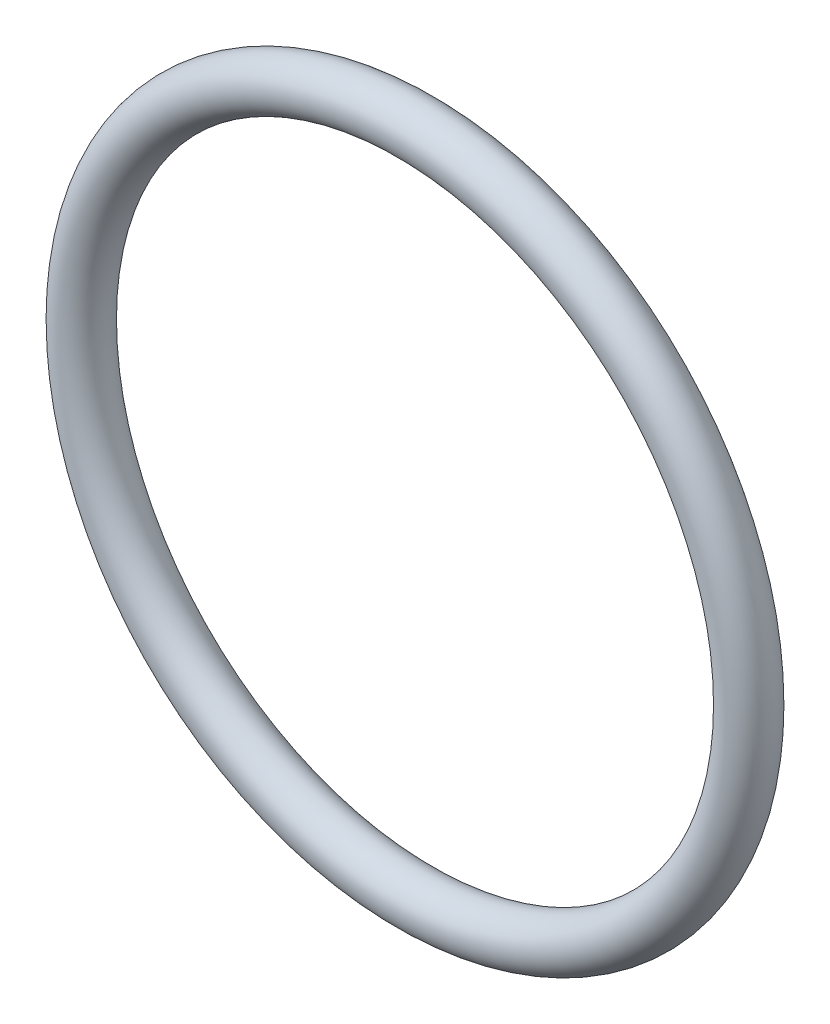
ISO-10303-21;
HEADER;
FILE_DESCRIPTION(('STEP AP214'),'2;1');
FILE_NAME('part.step','',(''),(''),'','','');
FILE_SCHEMA(('AUTOMOTIVE_DESIGN { 1 0 10303 214 1 1 1 1 }'));
ENDSEC;
DATA;
#1=APPLICATION_CONTEXT('core data for automotive mechanical design processes');
#2=APPLICATION_PROTOCOL_DEFINITION('international standard','automotive_design',2000,#1);
#3=PRODUCT_CONTEXT('',#1,'mechanical');
#4=PRODUCT('Part','Part','',(#3));
#5=PRODUCT_RELATED_PRODUCT_CATEGORY('part','',(#4));
#6=PRODUCT_DEFINITION_FORMATION('','',#4);
#7=PRODUCT_DEFINITION_CONTEXT('part definition',#1,'design');
#8=PRODUCT_DEFINITION('design','',#6,#7);
#9=PRODUCT_DEFINITION_SHAPE('','',#8);
#10=(LENGTH_UNIT() NAMED_UNIT(*) SI_UNIT(.MILLI.,.METRE.));
#11=(NAMED_UNIT(*) PLANE_ANGLE_UNIT() SI_UNIT($,.RADIAN.));
#12=(NAMED_UNIT(*) SI_UNIT($,.STERADIAN.) SOLID_ANGLE_UNIT());
#13=UNCERTAINTY_MEASURE_WITH_UNIT(LENGTH_MEASURE(1.E-05),#10,'distance_accuracy_value','');
#14=(GEOMETRIC_REPRESENTATION_CONTEXT(3) GLOBAL_UNCERTAINTY_ASSIGNED_CONTEXT((#13)) GLOBAL_UNIT_ASSIGNED_CONTEXT((#10,
#11,#12)) REPRESENTATION_CONTEXT('',''));
#15=CARTESIAN_POINT('',(0.,0.,0.));
#16=DIRECTION('',(0.,0.,1.));
#17=DIRECTION('',(1.,0.,0.));
#18=AXIS2_PLACEMENT_3D('',#15,#16,#17);
#19=CARTESIAN_POINT('',(0.,0.,0.));
#20=DIRECTION('',(0.,0.,-1.));
#21=DIRECTION('',(-1.,0.,0.));
#22=AXIS2_PLACEMENT_3D('',#19,#20,#21);
#23=TOROIDAL_SURFACE('',#22,17.018,1.27);
#24=CARTESIAN_POINT('',(-18.288,0.,0.));
#25=VERTEX_POINT('',#24);
#26=VERTEX_LOOP('',#25);
#27=FACE_BOUND('',#26,.T.);
#28=ADVANCED_FACE('F28',(#27),#23,.T.);
#29=CLOSED_SHELL('',(#28));
#30=MANIFOLD_SOLID_BREP('B2',#29);
#31=ADVANCED_BREP_SHAPE_REPRESENTATION('',(#18,#30),#14);
#32=SHAPE_DEFINITION_REPRESENTATION(#9,#31);
ENDSEC;
END-ISO-10303-21;
